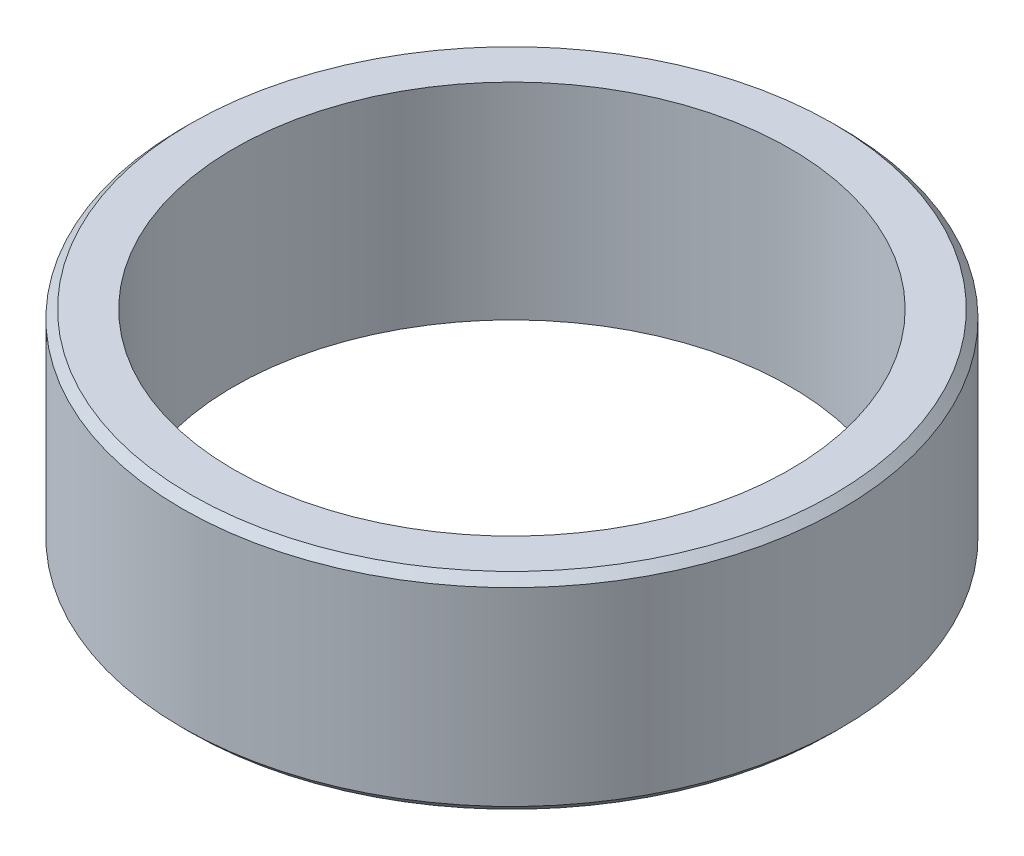
ISO-10303-21;
HEADER;
FILE_DESCRIPTION(('STEP AP214'),'2;1');
FILE_NAME('part.step','',(''),(''),'','','');
FILE_SCHEMA(('AUTOMOTIVE_DESIGN { 1 0 10303 214 1 1 1 1 }'));
ENDSEC;
DATA;
#1=APPLICATION_CONTEXT('core data for automotive mechanical design processes');
#2=APPLICATION_PROTOCOL_DEFINITION('international standard','automotive_design',2000,#1);
#3=PRODUCT_CONTEXT('',#1,'mechanical');
#4=PRODUCT('Part','Part','',(#3));
#5=PRODUCT_RELATED_PRODUCT_CATEGORY('part','',(#4));
#6=PRODUCT_DEFINITION_FORMATION('','',#4);
#7=PRODUCT_DEFINITION_CONTEXT('part definition',#1,'design');
#8=PRODUCT_DEFINITION('design','',#6,#7);
#9=PRODUCT_DEFINITION_SHAPE('','',#8);
#10=(LENGTH_UNIT() NAMED_UNIT(*) SI_UNIT(.MILLI.,.METRE.));
#11=(NAMED_UNIT(*) PLANE_ANGLE_UNIT() SI_UNIT($,.RADIAN.));
#12=(NAMED_UNIT(*) SI_UNIT($,.STERADIAN.) SOLID_ANGLE_UNIT());
#13=UNCERTAINTY_MEASURE_WITH_UNIT(LENGTH_MEASURE(1.E-05),#10,'distance_accuracy_value','');
#14=(GEOMETRIC_REPRESENTATION_CONTEXT(3) GLOBAL_UNCERTAINTY_ASSIGNED_CONTEXT((#13)) GLOBAL_UNIT_ASSIGNED_CONTEXT((#10,
#11,#12)) REPRESENTATION_CONTEXT('',''));
#15=CARTESIAN_POINT('',(0.,0.,0.));
#16=DIRECTION('',(0.,0.,1.));
#17=DIRECTION('',(1.,0.,0.));
#18=AXIS2_PLACEMENT_3D('',#15,#16,#17);
#19=CARTESIAN_POINT('',(0.,5.,0.));
#20=DIRECTION('',(0.,1.,0.));
#21=DIRECTION('',(0.,0.,1.));
#22=AXIS2_PLACEMENT_3D('',#19,#20,#21);
#23=PLANE('',#22);
#24=CARTESIAN_POINT('',(0.,5.,0.));
#25=DIRECTION('',(0.,1.,0.));
#26=DIRECTION('',(0.,0.,1.));
#27=AXIS2_PLACEMENT_3D('',#24,#25,#26);
#28=CIRCLE('',#27,7.80000000000001);
#29=CARTESIAN_POINT('',(0.,5.,7.80000000000001));
#30=VERTEX_POINT('',#29);
#31=EDGE_CURVE('E10',#30,#30,#28,.T.);
#32=ORIENTED_EDGE('',*,*,#31,.T.);
#33=EDGE_LOOP('',(#32));
#34=FACE_BOUND('',#33,.T.);
#35=CARTESIAN_POINT('',(0.,5.,0.));
#36=DIRECTION('',(0.,1.,0.));
#37=DIRECTION('',(0.,0.,1.));
#38=AXIS2_PLACEMENT_3D('',#35,#36,#37);
#39=CIRCLE('',#38,6.75);
#40=CARTESIAN_POINT('',(0.,5.,6.75));
#41=VERTEX_POINT('',#40);
#42=EDGE_CURVE('E53',#41,#41,#39,.T.);
#43=ORIENTED_EDGE('',*,*,#42,.F.);
#44=EDGE_LOOP('',(#43));
#45=FACE_BOUND('',#44,.T.);
#46=ADVANCED_FACE('F33',(#34,#45),#23,.T.);
#47=CARTESIAN_POINT('',(0.,0.,0.));
#48=DIRECTION('',(0.,1.,0.));
#49=DIRECTION('',(0.,0.,1.));
#50=AXIS2_PLACEMENT_3D('',#47,#48,#49);
#51=PLANE('',#50);
#52=CARTESIAN_POINT('',(0.,0.,0.));
#53=DIRECTION('',(0.,1.,0.));
#54=DIRECTION('',(0.,0.,1.));
#55=AXIS2_PLACEMENT_3D('',#52,#53,#54);
#56=CIRCLE('',#55,7.8);
#57=CARTESIAN_POINT('',(0.,0.,7.8));
#58=VERTEX_POINT('',#57);
#59=EDGE_CURVE('E40',#58,#58,#56,.F.);
#60=ORIENTED_EDGE('',*,*,#59,.T.);
#61=EDGE_LOOP('',(#60));
#62=FACE_BOUND('',#61,.T.);
#63=CARTESIAN_POINT('',(0.,0.,0.));
#64=DIRECTION('',(0.,1.,0.));
#65=DIRECTION('',(0.,0.,1.));
#66=AXIS2_PLACEMENT_3D('',#63,#64,#65);
#67=CIRCLE('',#66,6.75);
#68=CARTESIAN_POINT('',(0.,0.,6.75));
#69=VERTEX_POINT('',#68);
#70=EDGE_CURVE('E54',#69,#69,#67,.T.);
#71=ORIENTED_EDGE('',*,*,#70,.T.);
#72=EDGE_LOOP('',(#71));
#73=FACE_BOUND('',#72,.T.);
#74=ADVANCED_FACE('F64',(#62,#73),#51,.F.);
#75=CARTESIAN_POINT('',(0.,5.,0.));
#76=DIRECTION('',(0.,-1.,0.));
#77=DIRECTION('',(0.,0.,-1.));
#78=AXIS2_PLACEMENT_3D('',#75,#76,#77);
#79=CYLINDRICAL_SURFACE('',#78,8.);
#80=CARTESIAN_POINT('',(0.,0.199999999999999,0.));
#81=DIRECTION('',(0.,1.,0.));
#82=DIRECTION('',(0.,0.,1.));
#83=AXIS2_PLACEMENT_3D('',#80,#81,#82);
#84=CIRCLE('',#83,8.);
#85=CARTESIAN_POINT('',(0.,0.199999999999999,8.));
#86=VERTEX_POINT('',#85);
#87=EDGE_CURVE('E44',#86,#86,#84,.T.);
#88=ORIENTED_EDGE('',*,*,#87,.T.);
#89=EDGE_LOOP('',(#88));
#90=FACE_BOUND('',#89,.T.);
#91=CARTESIAN_POINT('',(0.,4.80000000000001,0.));
#92=DIRECTION('',(0.,1.,0.));
#93=DIRECTION('',(0.,0.,1.));
#94=AXIS2_PLACEMENT_3D('',#91,#92,#93);
#95=CIRCLE('',#94,8.);
#96=CARTESIAN_POINT('',(0.,4.80000000000001,8.));
#97=VERTEX_POINT('',#96);
#98=EDGE_CURVE('E48',#97,#97,#95,.F.);
#99=ORIENTED_EDGE('',*,*,#98,.T.);
#100=EDGE_LOOP('',(#99));
#101=FACE_BOUND('',#100,.T.);
#102=ADVANCED_FACE('F69',(#90,#101),#79,.T.);
#103=CARTESIAN_POINT('',(0.,5.,0.));
#104=DIRECTION('',(0.,-1.,0.));
#105=DIRECTION('',(0.,0.,-1.));
#106=AXIS2_PLACEMENT_3D('',#103,#104,#105);
#107=CYLINDRICAL_SURFACE('',#106,6.75);
#108=ORIENTED_EDGE('',*,*,#42,.T.);
#109=EDGE_LOOP('',(#108));
#110=FACE_BOUND('',#109,.T.);
#111=ORIENTED_EDGE('',*,*,#70,.F.);
#112=EDGE_LOOP('',(#111));
#113=FACE_BOUND('',#112,.T.);
#114=ADVANCED_FACE('F60',(#110,#113),#107,.F.);
#115=CARTESIAN_POINT('',(0.,0.199999999999999,0.));
#116=DIRECTION('',(0.,1.,0.));
#117=DIRECTION('',(0.,0.,1.));
#118=AXIS2_PLACEMENT_3D('',#115,#116,#117);
#119=CONICAL_SURFACE('',#118,8.,0.785398163397444);
#120=ORIENTED_EDGE('',*,*,#59,.F.);
#121=EDGE_LOOP('',(#120));
#122=FACE_BOUND('',#121,.T.);
#123=ORIENTED_EDGE('',*,*,#87,.F.);
#124=EDGE_LOOP('',(#123));
#125=FACE_BOUND('',#124,.T.);
#126=ADVANCED_FACE('F75',(#122,#125),#119,.T.);
#127=CARTESIAN_POINT('',(0.,5.,0.));
#128=DIRECTION('',(0.,-1.,0.));
#129=DIRECTION('',(0.,0.,-1.));
#130=AXIS2_PLACEMENT_3D('',#127,#128,#129);
#131=CONICAL_SURFACE('',#130,7.80000000000001,0.785398163397448);
#132=ORIENTED_EDGE('',*,*,#98,.F.);
#133=EDGE_LOOP('',(#132));
#134=FACE_BOUND('',#133,.T.);
#135=ORIENTED_EDGE('',*,*,#31,.F.);
#136=EDGE_LOOP('',(#135));
#137=FACE_BOUND('',#136,.T.);
#138=ADVANCED_FACE('F35',(#134,#137),#131,.T.);
#139=CLOSED_SHELL('',(#46,#74,#102,#114,#126,#138));
#140=MANIFOLD_SOLID_BREP('B2',#139);
#141=ADVANCED_BREP_SHAPE_REPRESENTATION('',(#18,#140),#14);
#142=SHAPE_DEFINITION_REPRESENTATION(#9,#141);
ENDSEC;
END-ISO-10303-21;
